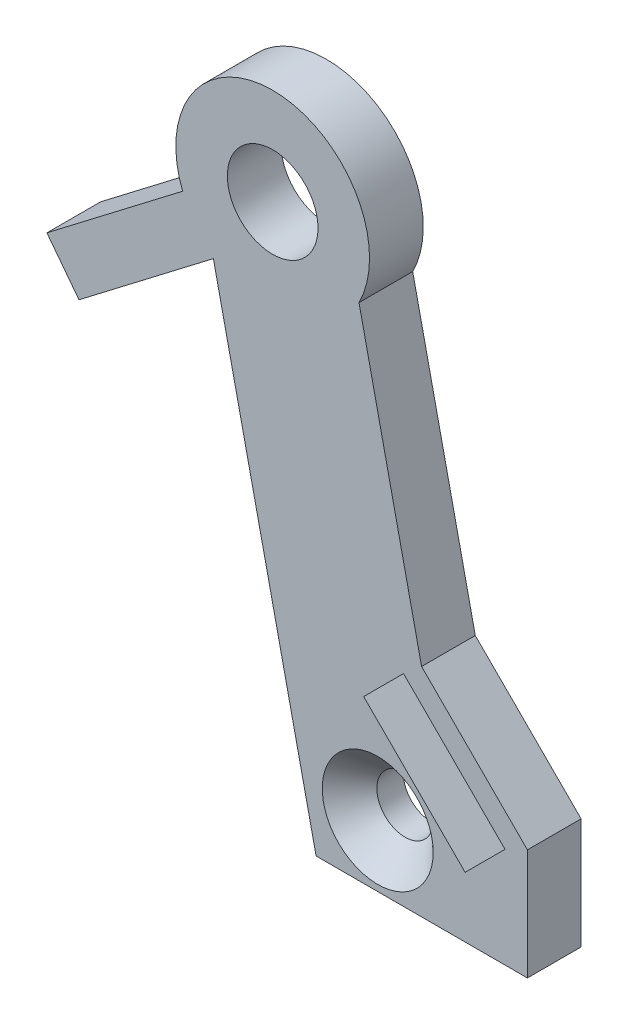
ISO-10303-21;
HEADER;
FILE_DESCRIPTION(('STEP AP214'),'2;1');
FILE_NAME('part.step','',(''),(''),'','','');
FILE_SCHEMA(('AUTOMOTIVE_DESIGN { 1 0 10303 214 1 1 1 1 }'));
ENDSEC;
DATA;
#1=APPLICATION_CONTEXT('core data for automotive mechanical design processes');
#2=APPLICATION_PROTOCOL_DEFINITION('international standard','automotive_design',2000,#1);
#3=PRODUCT_CONTEXT('',#1,'mechanical');
#4=PRODUCT('Part','Part','',(#3));
#5=PRODUCT_RELATED_PRODUCT_CATEGORY('part','',(#4));
#6=PRODUCT_DEFINITION_FORMATION('','',#4);
#7=PRODUCT_DEFINITION_CONTEXT('part definition',#1,'design');
#8=PRODUCT_DEFINITION('design','',#6,#7);
#9=PRODUCT_DEFINITION_SHAPE('','',#8);
#10=(LENGTH_UNIT() NAMED_UNIT(*) SI_UNIT(.MILLI.,.METRE.));
#11=(NAMED_UNIT(*) PLANE_ANGLE_UNIT() SI_UNIT($,.RADIAN.));
#12=(NAMED_UNIT(*) SI_UNIT($,.STERADIAN.) SOLID_ANGLE_UNIT());
#13=UNCERTAINTY_MEASURE_WITH_UNIT(LENGTH_MEASURE(1.E-05),#10,'distance_accuracy_value','');
#14=(GEOMETRIC_REPRESENTATION_CONTEXT(3) GLOBAL_UNCERTAINTY_ASSIGNED_CONTEXT((#13)) GLOBAL_UNIT_ASSIGNED_CONTEXT((#10,
#11,#12)) REPRESENTATION_CONTEXT('',''));
#15=CARTESIAN_POINT('',(0.,0.,0.));
#16=DIRECTION('',(0.,0.,1.));
#17=DIRECTION('',(1.,0.,0.));
#18=AXIS2_PLACEMENT_3D('',#15,#16,#17);
#19=CARTESIAN_POINT('',(8.20970869120796,8.20970869120796,3.05));
#20=DIRECTION('',(0.707106781186548,0.707106781186547,0.));
#21=DIRECTION('',(-0.707106781186547,0.707106781186548,0.));
#22=AXIS2_PLACEMENT_3D('',#19,#20,#21);
#23=PLANE('',#22);
#24=DIRECTION('',(0.707106781186547,-0.707106781186548,0.));
#25=VECTOR('',#24,1.);
#26=CARTESIAN_POINT('',(8.20970869120796,8.20970869120796,0.));
#27=LINE('',#26,#25);
#28=CARTESIAN_POINT('',(4.96428752719385,11.4551298552221,0.));
#29=VERTEX_POINT('',#28);
#30=CARTESIAN_POINT('',(10.7272077938642,5.6922095885517,0.));
#31=VERTEX_POINT('',#30);
#32=EDGE_CURVE('E221',#29,#31,#27,.T.);
#33=ORIENTED_EDGE('',*,*,#32,.T.);
#34=DIRECTION('',(0.,0.,-1.));
#35=VECTOR('',#34,1.);
#36=CARTESIAN_POINT('',(10.7272077938642,5.6922095885517,3.05));
#37=LINE('',#36,#35);
#38=CARTESIAN_POINT('',(10.7272077938642,5.6922095885517,3.05));
#39=VERTEX_POINT('',#38);
#40=EDGE_CURVE('E11',#39,#31,#37,.T.);
#41=ORIENTED_EDGE('',*,*,#40,.F.);
#42=DIRECTION('',(0.707106781186547,-0.707106781186548,0.));
#43=VECTOR('',#42,1.);
#44=CARTESIAN_POINT('',(8.20970869120796,8.20970869120796,3.05));
#45=LINE('',#44,#43);
#46=CARTESIAN_POINT('',(4.96428752719385,11.4551298552221,3.05));
#47=VERTEX_POINT('',#46);
#48=EDGE_CURVE('E168',#47,#39,#45,.T.);
#49=ORIENTED_EDGE('',*,*,#48,.F.);
#50=DIRECTION('',(0.,0.,-1.));
#51=VECTOR('',#50,1.);
#52=CARTESIAN_POINT('',(4.96428752719385,11.4551298552221,3.05));
#53=LINE('',#52,#51);
#54=EDGE_CURVE('E231',#47,#29,#53,.T.);
#55=ORIENTED_EDGE('',*,*,#54,.T.);
#56=EDGE_LOOP('',(#33,#41,#49,#55));
#57=FACE_BOUND('',#56,.T.);
#58=ADVANCED_FACE('F45',(#57),#23,.F.);
#59=CARTESIAN_POINT('',(2.51749910265625,-2.51749910265625,3.05));
#60=DIRECTION('',(-0.707106781186548,0.707106781186548,0.));
#61=DIRECTION('',(-0.707106781186548,-0.707106781186548,0.));
#62=AXIS2_PLACEMENT_3D('',#59,#60,#61);
#63=PLANE('',#62);
#64=DIRECTION('',(0.707106781186548,0.707106781186548,0.));
#65=VECTOR('',#64,1.);
#66=CARTESIAN_POINT('',(2.51749910265625,-2.51749910265625,0.));
#67=LINE('',#66,#65);
#68=CARTESIAN_POINT('',(8.46446609406726,3.42946788875475,0.));
#69=VERTEX_POINT('',#68);
#70=EDGE_CURVE('E158',#69,#31,#67,.T.);
#71=ORIENTED_EDGE('',*,*,#70,.F.);
#72=DIRECTION('',(0.,0.,-1.));
#73=VECTOR('',#72,1.);
#74=CARTESIAN_POINT('',(8.46446609406726,3.42946788875475,3.05));
#75=LINE('',#74,#73);
#76=CARTESIAN_POINT('',(8.46446609406726,3.42946788875475,3.05));
#77=VERTEX_POINT('',#76);
#78=EDGE_CURVE('E56',#77,#69,#75,.T.);
#79=ORIENTED_EDGE('',*,*,#78,.F.);
#80=DIRECTION('',(0.707106781186548,0.707106781186548,0.));
#81=VECTOR('',#80,1.);
#82=CARTESIAN_POINT('',(2.51749910265625,-2.51749910265625,3.05));
#83=LINE('',#82,#81);
#84=EDGE_CURVE('E156',#77,#39,#83,.T.);
#85=ORIENTED_EDGE('',*,*,#84,.T.);
#86=ORIENTED_EDGE('',*,*,#40,.T.);
#87=EDGE_LOOP('',(#71,#79,#85,#86));
#88=FACE_BOUND('',#87,.T.);
#89=ADVANCED_FACE('F154',(#88),#63,.T.);
#90=CARTESIAN_POINT('',(5.94696699141101,5.94696699141101,3.05));
#91=DIRECTION('',(-0.707106781186547,-0.707106781186548,0.));
#92=DIRECTION('',(0.707106781186548,-0.707106781186547,0.));
#93=AXIS2_PLACEMENT_3D('',#90,#91,#92);
#94=PLANE('',#93);
#95=DIRECTION('',(-0.707106781186548,0.707106781186547,0.));
#96=VECTOR('',#95,1.);
#97=CARTESIAN_POINT('',(5.94696699141101,5.94696699141101,0.));
#98=LINE('',#97,#96);
#99=CARTESIAN_POINT('',(2.7015458273969,9.19238815542512,0.));
#100=VERTEX_POINT('',#99);
#101=EDGE_CURVE('E107',#69,#100,#98,.T.);
#102=ORIENTED_EDGE('',*,*,#101,.T.);
#103=DIRECTION('',(0.,0.,-1.));
#104=VECTOR('',#103,1.);
#105=CARTESIAN_POINT('',(2.7015458273969,9.19238815542512,3.05));
#106=LINE('',#105,#104);
#107=CARTESIAN_POINT('',(2.7015458273969,9.19238815542512,3.05));
#108=VERTEX_POINT('',#107);
#109=EDGE_CURVE('E160',#108,#100,#106,.T.);
#110=ORIENTED_EDGE('',*,*,#109,.F.);
#111=DIRECTION('',(-0.707106781186548,0.707106781186547,0.));
#112=VECTOR('',#111,1.);
#113=CARTESIAN_POINT('',(5.94696699141101,5.94696699141101,3.05));
#114=LINE('',#113,#112);
#115=EDGE_CURVE('E162',#77,#108,#114,.T.);
#116=ORIENTED_EDGE('',*,*,#115,.F.);
#117=ORIENTED_EDGE('',*,*,#78,.T.);
#118=EDGE_LOOP('',(#102,#110,#116,#117));
#119=FACE_BOUND('',#118,.T.);
#120=ADVANCED_FACE('F163',(#119),#94,.F.);
#121=CARTESIAN_POINT('',(-2.4660489944469,30.9305626355909,3.05));
#122=DIRECTION('',(0.,0.,-1.));
#123=DIRECTION('',(-1.,0.,0.));
#124=AXIS2_PLACEMENT_3D('',#121,#122,#123);
#125=CYLINDRICAL_SURFACE('',#124,5.5);
#126=CARTESIAN_POINT('',(-2.4660489944469,30.9305626355909,0.));
#127=DIRECTION('',(0.,0.,1.));
#128=DIRECTION('',(1.,0.,0.));
#129=AXIS2_PLACEMENT_3D('',#126,#127,#128);
#130=CIRCLE('',#129,5.5);
#131=CARTESIAN_POINT('',(2.43581292995001,28.436219099879,0.));
#132=VERTEX_POINT('',#131);
#133=CARTESIAN_POINT('',(-7.57966444011929,28.9054855818024,0.));
#134=VERTEX_POINT('',#133);
#135=EDGE_CURVE('E180',#132,#134,#130,.T.);
#136=ORIENTED_EDGE('',*,*,#135,.T.);
#137=DIRECTION('',(0.,0.,-1.));
#138=VECTOR('',#137,1.);
#139=CARTESIAN_POINT('',(-7.57966444011929,28.9054855818024,3.05));
#140=LINE('',#139,#138);
#141=CARTESIAN_POINT('',(-7.57966444011929,28.9054855818024,3.05));
#142=VERTEX_POINT('',#141);
#143=EDGE_CURVE('E49',#142,#134,#140,.T.);
#144=ORIENTED_EDGE('',*,*,#143,.F.);
#145=CARTESIAN_POINT('',(-2.4660489944469,30.9305626355909,3.05));
#146=DIRECTION('',(0.,0.,1.));
#147=DIRECTION('',(1.,0.,0.));
#148=AXIS2_PLACEMENT_3D('',#145,#146,#147);
#149=CIRCLE('',#148,5.5);
#150=CARTESIAN_POINT('',(2.43581292995001,28.436219099879,3.05));
#151=VERTEX_POINT('',#150);
#152=EDGE_CURVE('E122',#151,#142,#149,.T.);
#153=ORIENTED_EDGE('',*,*,#152,.F.);
#154=DIRECTION('',(0.,0.,-1.));
#155=VECTOR('',#154,1.);
#156=CARTESIAN_POINT('',(2.43581292995001,28.436219099879,3.05));
#157=LINE('',#156,#155);
#158=EDGE_CURVE('E179',#151,#132,#157,.T.);
#159=ORIENTED_EDGE('',*,*,#158,.T.);
#160=EDGE_LOOP('',(#136,#144,#153,#159));
#161=FACE_BOUND('',#160,.T.);
#162=ADVANCED_FACE('F47',(#161),#125,.T.);
#163=CARTESIAN_POINT('',(-16.7513680405315,21.8853191686301,3.05));
#164=DIRECTION('',(-0.607805742434507,0.794085750699279,0.));
#165=DIRECTION('',(-0.794085750699279,-0.607805742434507,0.));
#166=AXIS2_PLACEMENT_3D('',#163,#164,#165);
#167=PLANE('',#166);
#168=DIRECTION('',(0.794085750699279,0.607805742434507,0.));
#169=VECTOR('',#168,1.);
#170=CARTESIAN_POINT('',(-16.7513680405315,21.8853191686301,0.));
#171=LINE('',#170,#169);
#172=CARTESIAN_POINT('',(-15.2890438685878,23.0046051251221,0.));
#173=VERTEX_POINT('',#172);
#174=EDGE_CURVE('E184',#173,#134,#171,.T.);
#175=ORIENTED_EDGE('',*,*,#174,.F.);
#176=DIRECTION('',(0.,0.,-1.));
#177=VECTOR('',#176,1.);
#178=CARTESIAN_POINT('',(-15.2890438685878,23.0046051251221,3.05));
#179=LINE('',#178,#177);
#180=CARTESIAN_POINT('',(-15.2890438685878,23.0046051251221,3.05));
#181=VERTEX_POINT('',#180);
#182=EDGE_CURVE('E255',#181,#173,#179,.T.);
#183=ORIENTED_EDGE('',*,*,#182,.F.);
#184=DIRECTION('',(0.794085750699279,0.607805742434507,0.));
#185=VECTOR('',#184,1.);
#186=CARTESIAN_POINT('',(-16.7513680405315,21.8853191686301,3.05));
#187=LINE('',#186,#185);
#188=EDGE_CURVE('E265',#181,#142,#187,.T.);
#189=ORIENTED_EDGE('',*,*,#188,.T.);
#190=ORIENTED_EDGE('',*,*,#143,.T.);
#191=EDGE_LOOP('',(#175,#183,#189,#190));
#192=FACE_BOUND('',#191,.T.);
#193=ADVANCED_FACE('F264',(#192),#167,.T.);
#194=CARTESIAN_POINT('',(1.46232417194366,1.11928595649204,3.05));
#195=DIRECTION('',(-0.794085750699279,-0.607805742434507,0.));
#196=DIRECTION('',(0.607805742434507,-0.794085750699279,0.));
#197=AXIS2_PLACEMENT_3D('',#194,#195,#196);
#198=PLANE('',#197);
#199=DIRECTION('',(-0.607805742434507,0.794085750699279,0.));
#200=VECTOR('',#199,1.);
#201=CARTESIAN_POINT('',(1.46232417194366,1.11928595649204,0.));
#202=LINE('',#201,#200);
#203=CARTESIAN_POINT('',(-13.4656266412843,20.6223478730243,0.));
#204=VERTEX_POINT('',#203);
#205=EDGE_CURVE('E189',#204,#173,#202,.T.);
#206=ORIENTED_EDGE('',*,*,#205,.F.);
#207=DIRECTION('',(0.,0.,-1.));
#208=VECTOR('',#207,1.);
#209=CARTESIAN_POINT('',(-13.4656266412843,20.6223478730243,3.05));
#210=LINE('',#209,#208);
#211=CARTESIAN_POINT('',(-13.4656266412843,20.6223478730243,3.05));
#212=VERTEX_POINT('',#211);
#213=EDGE_CURVE('E253',#212,#204,#210,.T.);
#214=ORIENTED_EDGE('',*,*,#213,.F.);
#215=DIRECTION('',(-0.607805742434507,0.794085750699279,0.));
#216=VECTOR('',#215,1.);
#217=CARTESIAN_POINT('',(1.46232417194366,1.11928595649204,3.05));
#218=LINE('',#217,#216);
#219=EDGE_CURVE('E276',#212,#181,#218,.T.);
#220=ORIENTED_EDGE('',*,*,#219,.T.);
#221=ORIENTED_EDGE('',*,*,#182,.T.);
#222=EDGE_LOOP('',(#206,#214,#220,#221));
#223=FACE_BOUND('',#222,.T.);
#224=ADVANCED_FACE('F273',(#223),#198,.T.);
#225=CARTESIAN_POINT('',(-14.927950813228,19.5030619165323,3.05));
#226=DIRECTION('',(-0.607805742434507,0.794085750699279,0.));
#227=DIRECTION('',(-0.794085750699279,-0.607805742434507,0.));
#228=AXIS2_PLACEMENT_3D('',#225,#226,#227);
#229=PLANE('',#228);
#230=DIRECTION('',(0.79408575069928,0.607805742434507,0.));
#231=VECTOR('',#230,1.);
#232=CARTESIAN_POINT('',(-14.927950813228,19.5030619165323,0.));
#233=LINE('',#232,#231);
#234=CARTESIAN_POINT('',(-5.83352368407782,26.4640797013016,0.));
#235=VERTEX_POINT('',#234);
#236=EDGE_CURVE('E193',#204,#235,#233,.T.);
#237=ORIENTED_EDGE('',*,*,#236,.T.);
#238=DIRECTION('',(0.,0.,-1.));
#239=VECTOR('',#238,1.);
#240=CARTESIAN_POINT('',(-5.83352368407782,26.4640797013016,3.05));
#241=LINE('',#240,#239);
#242=CARTESIAN_POINT('',(-5.83352368407782,26.4640797013016,3.05));
#243=VERTEX_POINT('',#242);
#244=EDGE_CURVE('E250',#243,#235,#241,.T.);
#245=ORIENTED_EDGE('',*,*,#244,.F.);
#246=DIRECTION('',(0.79408575069928,0.607805742434507,0.));
#247=VECTOR('',#246,1.);
#248=CARTESIAN_POINT('',(-14.927950813228,19.5030619165323,3.05));
#249=LINE('',#248,#247);
#250=EDGE_CURVE('E279',#212,#243,#249,.T.);
#251=ORIENTED_EDGE('',*,*,#250,.F.);
#252=ORIENTED_EDGE('',*,*,#213,.T.);
#253=EDGE_LOOP('',(#237,#245,#251,#252));
#254=FACE_BOUND('',#253,.T.);
#255=ADVANCED_FACE('F280',(#254),#229,.F.);
#256=CARTESIAN_POINT('',(0.,0.,3.05));
#257=DIRECTION('',(-0.976555905777288,-0.215263937740396,0.));
#258=DIRECTION('',(0.215263937740396,-0.976555905777288,0.));
#259=AXIS2_PLACEMENT_3D('',#256,#257,#258);
#260=PLANE('',#259);
#261=DIRECTION('',(-0.215263937740396,0.976555905777288,0.));
#262=VECTOR('',#261,1.);
#263=CARTESIAN_POINT('',(0.,0.,0.));
#264=LINE('',#263,#262);
#265=CARTESIAN_POINT('',(0.,0.,0.));
#266=VERTEX_POINT('',#265);
#267=EDGE_CURVE('E197',#266,#235,#264,.T.);
#268=ORIENTED_EDGE('',*,*,#267,.F.);
#269=DIRECTION('',(0.,0.,-1.));
#270=VECTOR('',#269,1.);
#271=CARTESIAN_POINT('',(0.,0.,3.05));
#272=LINE('',#271,#270);
#273=CARTESIAN_POINT('',(0.,0.,3.05));
#274=VERTEX_POINT('',#273);
#275=EDGE_CURVE('E247',#274,#266,#272,.T.);
#276=ORIENTED_EDGE('',*,*,#275,.F.);
#277=DIRECTION('',(-0.215263937740396,0.976555905777288,0.));
#278=VECTOR('',#277,1.);
#279=CARTESIAN_POINT('',(0.,0.,3.05));
#280=LINE('',#279,#278);
#281=EDGE_CURVE('E284',#274,#243,#280,.T.);
#282=ORIENTED_EDGE('',*,*,#281,.T.);
#283=ORIENTED_EDGE('',*,*,#244,.T.);
#284=EDGE_LOOP('',(#268,#276,#282,#283));
#285=FACE_BOUND('',#284,.T.);
#286=ADVANCED_FACE('F353',(#285),#260,.T.);
#287=CARTESIAN_POINT('',(0.,0.,3.05));
#288=DIRECTION('',(0.,1.,0.));
#289=DIRECTION('',(0.,0.,1.));
#290=AXIS2_PLACEMENT_3D('',#287,#288,#289);
#291=PLANE('',#290);
#292=DIRECTION('',(1.,0.,0.));
#293=VECTOR('',#292,1.);
#294=CARTESIAN_POINT('',(0.,0.,0.));
#295=LINE('',#294,#293);
#296=CARTESIAN_POINT('',(12.,0.,0.));
#297=VERTEX_POINT('',#296);
#298=EDGE_CURVE('E201',#266,#297,#295,.T.);
#299=ORIENTED_EDGE('',*,*,#298,.T.);
#300=DIRECTION('',(0.,0.,-1.));
#301=VECTOR('',#300,1.);
#302=CARTESIAN_POINT('',(12.,0.,3.05));
#303=LINE('',#302,#301);
#304=CARTESIAN_POINT('',(12.,0.,3.05));
#305=VERTEX_POINT('',#304);
#306=EDGE_CURVE('E244',#305,#297,#303,.T.);
#307=ORIENTED_EDGE('',*,*,#306,.F.);
#308=DIRECTION('',(1.,0.,0.));
#309=VECTOR('',#308,1.);
#310=CARTESIAN_POINT('',(0.,0.,3.05));
#311=LINE('',#310,#309);
#312=EDGE_CURVE('E295',#274,#305,#311,.T.);
#313=ORIENTED_EDGE('',*,*,#312,.F.);
#314=ORIENTED_EDGE('',*,*,#275,.T.);
#315=EDGE_LOOP('',(#299,#307,#313,#314));
#316=FACE_BOUND('',#315,.T.);
#317=ADVANCED_FACE('F349',(#316),#291,.F.);
#318=CARTESIAN_POINT('',(12.,0.,3.05));
#319=DIRECTION('',(1.,0.,0.));
#320=DIRECTION('',(0.,0.,-1.));
#321=AXIS2_PLACEMENT_3D('',#318,#319,#320);
#322=PLANE('',#321);
#323=DIRECTION('',(0.,-1.,0.));
#324=VECTOR('',#323,1.);
#325=CARTESIAN_POINT('',(12.,0.,0.));
#326=LINE('',#325,#324);
#327=CARTESIAN_POINT('',(12.,6.3039086153561,0.));
#328=VERTEX_POINT('',#327);
#329=EDGE_CURVE('E205',#328,#297,#326,.T.);
#330=ORIENTED_EDGE('',*,*,#329,.F.);
#331=DIRECTION('',(0.,0.,-1.));
#332=VECTOR('',#331,1.);
#333=CARTESIAN_POINT('',(12.,6.3039086153561,3.05));
#334=LINE('',#333,#332);
#335=CARTESIAN_POINT('',(12.,6.3039086153561,3.05));
#336=VERTEX_POINT('',#335);
#337=EDGE_CURVE('E241',#336,#328,#334,.T.);
#338=ORIENTED_EDGE('',*,*,#337,.F.);
#339=DIRECTION('',(0.,-1.,0.));
#340=VECTOR('',#339,1.);
#341=CARTESIAN_POINT('',(12.,0.,3.05));
#342=LINE('',#341,#340);
#343=EDGE_CURVE('E298',#336,#305,#342,.T.);
#344=ORIENTED_EDGE('',*,*,#343,.T.);
#345=ORIENTED_EDGE('',*,*,#306,.T.);
#346=EDGE_LOOP('',(#330,#338,#344,#345));
#347=FACE_BOUND('',#346,.T.);
#348=ADVANCED_FACE('F345',(#347),#322,.T.);
#349=CARTESIAN_POINT('',(9.15195430767805,9.15195430767805,3.05));
#350=DIRECTION('',(0.707106781186548,0.707106781186548,0.));
#351=DIRECTION('',(-0.707106781186548,0.707106781186548,0.));
#352=AXIS2_PLACEMENT_3D('',#349,#350,#351);
#353=PLANE('',#352);
#354=DIRECTION('',(0.707106781186548,-0.707106781186548,0.));
#355=VECTOR('',#354,1.);
#356=CARTESIAN_POINT('',(9.15195430767805,9.15195430767805,0.));
#357=LINE('',#356,#355);
#358=CARTESIAN_POINT('',(5.98959235991435,12.3143162554418,0.));
#359=VERTEX_POINT('',#358);
#360=EDGE_CURVE('E209',#359,#328,#357,.T.);
#361=ORIENTED_EDGE('',*,*,#360,.F.);
#362=DIRECTION('',(0.,0.,-1.));
#363=VECTOR('',#362,1.);
#364=CARTESIAN_POINT('',(5.98959235991435,12.3143162554418,3.05));
#365=LINE('',#364,#363);
#366=CARTESIAN_POINT('',(5.98959235991435,12.3143162554418,3.05));
#367=VERTEX_POINT('',#366);
#368=EDGE_CURVE('E238',#367,#359,#365,.T.);
#369=ORIENTED_EDGE('',*,*,#368,.F.);
#370=DIRECTION('',(0.707106781186548,-0.707106781186548,0.));
#371=VECTOR('',#370,1.);
#372=CARTESIAN_POINT('',(9.15195430767805,9.15195430767805,3.05));
#373=LINE('',#372,#371);
#374=EDGE_CURVE('E302',#367,#336,#373,.T.);
#375=ORIENTED_EDGE('',*,*,#374,.T.);
#376=ORIENTED_EDGE('',*,*,#337,.T.);
#377=EDGE_LOOP('',(#361,#369,#375,#376));
#378=FACE_BOUND('',#377,.T.);
#379=ADVANCED_FACE('F342',(#378),#353,.T.);
#380=CARTESIAN_POINT('',(-3.24542116401411,3.24542116401411,3.05));
#381=DIRECTION('',(-0.707106781186548,0.707106781186547,0.));
#382=DIRECTION('',(-0.707106781186547,-0.707106781186548,0.));
#383=AXIS2_PLACEMENT_3D('',#380,#381,#382);
#384=PLANE('',#383);
#385=DIRECTION('',(0.707106781186547,0.707106781186548,0.));
#386=VECTOR('',#385,1.);
#387=CARTESIAN_POINT('',(-3.24542116401411,3.24542116401411,0.));
#388=LINE('',#387,#386);
#389=EDGE_CURVE('E113',#100,#29,#388,.T.);
#390=ORIENTED_EDGE('',*,*,#389,.T.);
#391=ORIENTED_EDGE('',*,*,#54,.F.);
#392=DIRECTION('',(0.707106781186547,0.707106781186548,0.));
#393=VECTOR('',#392,1.);
#394=CARTESIAN_POINT('',(-3.24542116401411,3.24542116401411,3.05));
#395=LINE('',#394,#393);
#396=EDGE_CURVE('E65',#108,#47,#395,.T.);
#397=ORIENTED_EDGE('',*,*,#396,.F.);
#398=ORIENTED_EDGE('',*,*,#109,.T.);
#399=EDGE_LOOP('',(#390,#391,#397,#398));
#400=FACE_BOUND('',#399,.T.);
#401=ADVANCED_FACE('F340',(#400),#384,.F.);
#402=CARTESIAN_POINT('',(-2.4660489944469,30.9305626355909,3.05));
#403=DIRECTION('',(0.,0.,-1.));
#404=DIRECTION('',(-1.,0.,0.));
#405=AXIS2_PLACEMENT_3D('',#402,#403,#404);
#406=CYLINDRICAL_SURFACE('',#405,2.575);
#407=CARTESIAN_POINT('',(-2.4660489944469,30.9305626355909,3.05));
#408=DIRECTION('',(0.,0.,1.));
#409=DIRECTION('',(1.,0.,0.));
#410=AXIS2_PLACEMENT_3D('',#407,#408,#409);
#411=CIRCLE('',#410,2.575);
#412=CARTESIAN_POINT('',(0.108951005553102,30.9305626355909,3.05));
#413=VERTEX_POINT('',#412);
#414=EDGE_CURVE('E173',#413,#413,#411,.T.);
#415=ORIENTED_EDGE('',*,*,#414,.T.);
#416=EDGE_LOOP('',(#415));
#417=FACE_BOUND('',#416,.T.);
#418=CARTESIAN_POINT('',(-2.4660489944469,30.9305626355909,0.));
#419=DIRECTION('',(0.,0.,1.));
#420=DIRECTION('',(1.,0.,0.));
#421=AXIS2_PLACEMENT_3D('',#418,#419,#420);
#422=CIRCLE('',#421,2.575);
#423=CARTESIAN_POINT('',(0.108951005553102,30.9305626355909,0.));
#424=VERTEX_POINT('',#423);
#425=EDGE_CURVE('E217',#424,#424,#422,.T.);
#426=ORIENTED_EDGE('',*,*,#425,.F.);
#427=EDGE_LOOP('',(#426));
#428=FACE_BOUND('',#427,.T.);
#429=ADVANCED_FACE('F313',(#417,#428),#406,.F.);
#430=CARTESIAN_POINT('',(8.30072519910672,1.82974347079325,3.05));
#431=DIRECTION('',(0.976555905777289,0.215263937740388,0.));
#432=DIRECTION('',(-0.215263937740388,0.97655590577729,0.));
#433=AXIS2_PLACEMENT_3D('',#430,#431,#432);
#434=PLANE('',#433);
#435=DIRECTION('',(0.215263937740388,-0.97655590577729,0.));
#436=VECTOR('',#435,1.);
#437=CARTESIAN_POINT('',(8.30072519910672,1.82974347079325,0.));
#438=LINE('',#437,#436);
#439=EDGE_CURVE('E213',#132,#359,#438,.T.);
#440=ORIENTED_EDGE('',*,*,#439,.F.);
#441=ORIENTED_EDGE('',*,*,#158,.F.);
#442=DIRECTION('',(0.215263937740388,-0.97655590577729,0.));
#443=VECTOR('',#442,1.);
#444=CARTESIAN_POINT('',(8.30072519910672,1.82974347079325,3.05));
#445=LINE('',#444,#443);
#446=EDGE_CURVE('E306',#151,#367,#445,.T.);
#447=ORIENTED_EDGE('',*,*,#446,.T.);
#448=ORIENTED_EDGE('',*,*,#368,.T.);
#449=EDGE_LOOP('',(#440,#441,#447,#448));
#450=FACE_BOUND('',#449,.T.);
#451=ADVANCED_FACE('F316',(#450),#434,.T.);
#452=CARTESIAN_POINT('',(0.,0.,3.05));
#453=DIRECTION('',(0.,0.,1.));
#454=DIRECTION('',(1.,0.,0.));
#455=AXIS2_PLACEMENT_3D('',#452,#453,#454);
#456=PLANE('',#455);
#457=CARTESIAN_POINT('',(3.5,3.5,3.05));
#458=DIRECTION('',(0.,0.,1.));
#459=DIRECTION('',(1.,0.,0.));
#460=AXIS2_PLACEMENT_3D('',#457,#458,#459);
#461=CIRCLE('',#460,3.15);
#462=CARTESIAN_POINT('',(6.65,3.5,3.05));
#463=VERTEX_POINT('',#462);
#464=EDGE_CURVE('E562',#463,#463,#461,.T.);
#465=ORIENTED_EDGE('',*,*,#464,.F.);
#466=EDGE_LOOP('',(#465));
#467=FACE_BOUND('',#466,.T.);
#468=ORIENTED_EDGE('',*,*,#152,.T.);
#469=ORIENTED_EDGE('',*,*,#188,.F.);
#470=ORIENTED_EDGE('',*,*,#219,.F.);
#471=ORIENTED_EDGE('',*,*,#250,.T.);
#472=ORIENTED_EDGE('',*,*,#281,.F.);
#473=ORIENTED_EDGE('',*,*,#312,.T.);
#474=ORIENTED_EDGE('',*,*,#343,.F.);
#475=ORIENTED_EDGE('',*,*,#374,.F.);
#476=ORIENTED_EDGE('',*,*,#446,.F.);
#477=EDGE_LOOP('',(#468,#469,#470,#471,#472,#473,#474,#475,#476));
#478=FACE_BOUND('',#477,.T.);
#479=ORIENTED_EDGE('',*,*,#414,.F.);
#480=EDGE_LOOP('',(#479));
#481=FACE_BOUND('',#480,.T.);
#482=ORIENTED_EDGE('',*,*,#48,.T.);
#483=ORIENTED_EDGE('',*,*,#84,.F.);
#484=ORIENTED_EDGE('',*,*,#115,.T.);
#485=ORIENTED_EDGE('',*,*,#396,.T.);
#486=EDGE_LOOP('',(#482,#483,#484,#485));
#487=FACE_BOUND('',#486,.T.);
#488=ADVANCED_FACE('F166',(#467,#478,#481,#487),#456,.T.);
#489=CARTESIAN_POINT('',(0.,0.,0.));
#490=DIRECTION('',(0.,0.,1.));
#491=DIRECTION('',(1.,0.,0.));
#492=AXIS2_PLACEMENT_3D('',#489,#490,#491);
#493=PLANE('',#492);
#494=CARTESIAN_POINT('',(3.5,3.5,0.));
#495=DIRECTION('',(0.,0.,1.));
#496=DIRECTION('',(1.,0.,0.));
#497=AXIS2_PLACEMENT_3D('',#494,#495,#496);
#498=CIRCLE('',#497,1.6);
#499=CARTESIAN_POINT('',(5.1,3.5,0.));
#500=VERTEX_POINT('',#499);
#501=EDGE_CURVE('E185',#500,#500,#498,.T.);
#502=ORIENTED_EDGE('',*,*,#501,.T.);
#503=EDGE_LOOP('',(#502));
#504=FACE_BOUND('',#503,.T.);
#505=ORIENTED_EDGE('',*,*,#135,.F.);
#506=ORIENTED_EDGE('',*,*,#439,.T.);
#507=ORIENTED_EDGE('',*,*,#360,.T.);
#508=ORIENTED_EDGE('',*,*,#329,.T.);
#509=ORIENTED_EDGE('',*,*,#298,.F.);
#510=ORIENTED_EDGE('',*,*,#267,.T.);
#511=ORIENTED_EDGE('',*,*,#236,.F.);
#512=ORIENTED_EDGE('',*,*,#205,.T.);
#513=ORIENTED_EDGE('',*,*,#174,.T.);
#514=EDGE_LOOP('',(#505,#506,#507,#508,#509,#510,#511,#512,#513));
#515=FACE_BOUND('',#514,.T.);
#516=ORIENTED_EDGE('',*,*,#425,.T.);
#517=EDGE_LOOP('',(#516));
#518=FACE_BOUND('',#517,.T.);
#519=ORIENTED_EDGE('',*,*,#32,.F.);
#520=ORIENTED_EDGE('',*,*,#389,.F.);
#521=ORIENTED_EDGE('',*,*,#101,.F.);
#522=ORIENTED_EDGE('',*,*,#70,.T.);
#523=EDGE_LOOP('',(#519,#520,#521,#522));
#524=FACE_BOUND('',#523,.T.);
#525=ADVANCED_FACE('F270',(#504,#515,#518,#524),#493,.F.);
#526=CARTESIAN_POINT('',(3.5,3.5,3.05));
#527=DIRECTION('',(0.,0.,1.));
#528=DIRECTION('',(1.,0.,0.));
#529=AXIS2_PLACEMENT_3D('',#526,#527,#528);
#530=CYLINDRICAL_SURFACE('',#529,1.6);
#531=ORIENTED_EDGE('',*,*,#501,.F.);
#532=EDGE_LOOP('',(#531));
#533=FACE_BOUND('',#532,.T.);
#534=CARTESIAN_POINT('',(3.5,3.5,1.5));
#535=DIRECTION('',(0.,0.,1.));
#536=DIRECTION('',(1.,0.,0.));
#537=AXIS2_PLACEMENT_3D('',#534,#535,#536);
#538=CIRCLE('',#537,1.6);
#539=CARTESIAN_POINT('',(5.1,3.5,1.5));
#540=VERTEX_POINT('',#539);
#541=EDGE_CURVE('E560',#540,#540,#538,.T.);
#542=ORIENTED_EDGE('',*,*,#541,.T.);
#543=EDGE_LOOP('',(#542));
#544=FACE_BOUND('',#543,.T.);
#545=ADVANCED_FACE('F323',(#533,#544),#530,.F.);
#546=CARTESIAN_POINT('',(3.5,3.5,3.05));
#547=DIRECTION('',(0.,0.,1.));
#548=DIRECTION('',(1.,0.,0.));
#549=AXIS2_PLACEMENT_3D('',#546,#547,#548);
#550=CONICAL_SURFACE('',#549,3.15,0.785398163397449);
#551=ORIENTED_EDGE('',*,*,#541,.F.);
#552=EDGE_LOOP('',(#551));
#553=FACE_BOUND('',#552,.T.);
#554=ORIENTED_EDGE('',*,*,#464,.T.);
#555=EDGE_LOOP('',(#554));
#556=FACE_BOUND('',#555,.T.);
#557=ADVANCED_FACE('F408',(#553,#556),#550,.F.);
#558=CLOSED_SHELL('',(#58,#89,#120,#162,#193,#224,#255,#286,#317,#348,#379,#401,#429,#451,#488,
#525,#545,#557));
#559=MANIFOLD_SOLID_BREP('B2',#558);
#560=ADVANCED_BREP_SHAPE_REPRESENTATION('',(#18,#559),#14);
#561=SHAPE_DEFINITION_REPRESENTATION(#9,#560);
ENDSEC;
END-ISO-10303-21;
